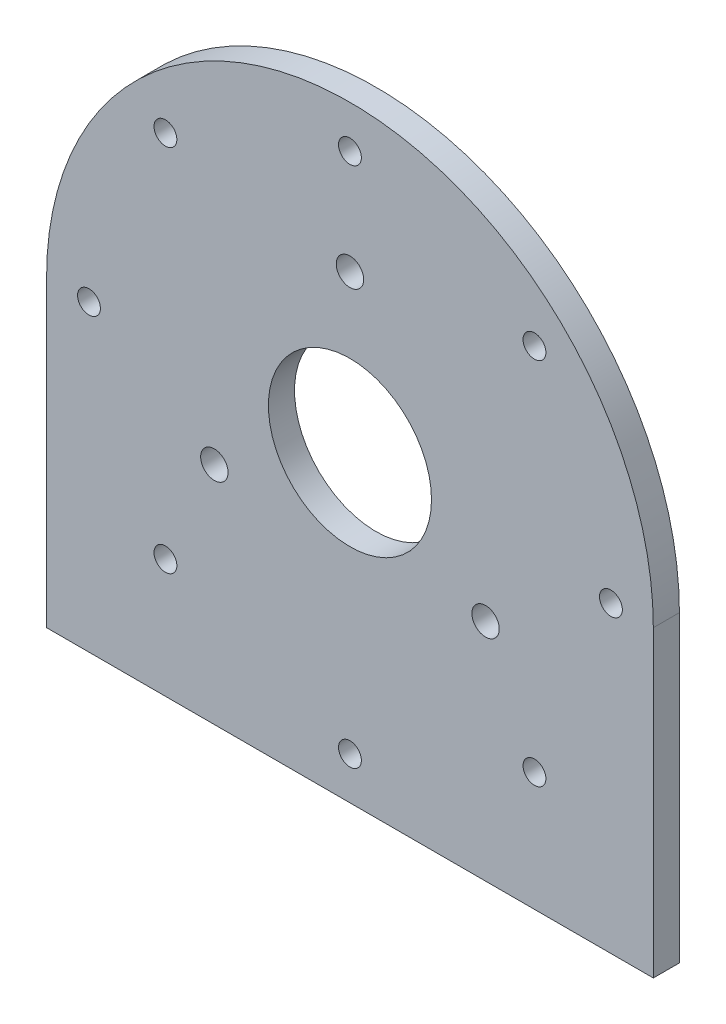
ISO-10303-21;
HEADER;
FILE_DESCRIPTION(('STEP AP214'),'2;1');
FILE_NAME('part.step','',(''),(''),'','','');
FILE_SCHEMA(('AUTOMOTIVE_DESIGN { 1 0 10303 214 1 1 1 1 }'));
ENDSEC;
DATA;
#1=APPLICATION_CONTEXT('core data for automotive mechanical design processes');
#2=APPLICATION_PROTOCOL_DEFINITION('international standard','automotive_design',2000,#1);
#3=PRODUCT_CONTEXT('',#1,'mechanical');
#4=PRODUCT('Part','Part','',(#3));
#5=PRODUCT_RELATED_PRODUCT_CATEGORY('part','',(#4));
#6=PRODUCT_DEFINITION_FORMATION('','',#4);
#7=PRODUCT_DEFINITION_CONTEXT('part definition',#1,'design');
#8=PRODUCT_DEFINITION('design','',#6,#7);
#9=PRODUCT_DEFINITION_SHAPE('','',#8);
#10=(LENGTH_UNIT() NAMED_UNIT(*) SI_UNIT(.MILLI.,.METRE.));
#11=(NAMED_UNIT(*) PLANE_ANGLE_UNIT() SI_UNIT($,.RADIAN.));
#12=(NAMED_UNIT(*) SI_UNIT($,.STERADIAN.) SOLID_ANGLE_UNIT());
#13=UNCERTAINTY_MEASURE_WITH_UNIT(LENGTH_MEASURE(1.E-05),#10,'distance_accuracy_value','');
#14=(GEOMETRIC_REPRESENTATION_CONTEXT(3) GLOBAL_UNCERTAINTY_ASSIGNED_CONTEXT((#13)) GLOBAL_UNIT_ASSIGNED_CONTEXT((#10,
#11,#12)) REPRESENTATION_CONTEXT('',''));
#15=CARTESIAN_POINT('',(0.,0.,0.));
#16=DIRECTION('',(0.,0.,1.));
#17=DIRECTION('',(1.,0.,0.));
#18=AXIS2_PLACEMENT_3D('',#15,#16,#17);
#19=CARTESIAN_POINT('',(0.,0.,4.));
#20=DIRECTION('',(0.,0.,-1.));
#21=DIRECTION('',(-1.,0.,0.));
#22=AXIS2_PLACEMENT_3D('',#19,#20,#21);
#23=CYLINDRICAL_SURFACE('',#22,46.5);
#24=CARTESIAN_POINT('',(0.,0.,0.));
#25=DIRECTION('',(0.,0.,1.));
#26=DIRECTION('',(1.,0.,0.));
#27=AXIS2_PLACEMENT_3D('',#24,#25,#26);
#28=CIRCLE('',#27,46.5);
#29=CARTESIAN_POINT('',(-46.5,0.,0.));
#30=VERTEX_POINT('',#29);
#31=CARTESIAN_POINT('',(46.5,0.,0.));
#32=VERTEX_POINT('',#31);
#33=EDGE_CURVE('E119',#30,#32,#28,.F.);
#34=ORIENTED_EDGE('',*,*,#33,.F.);
#35=DIRECTION('',(0.,0.,-1.));
#36=VECTOR('',#35,1.);
#37=CARTESIAN_POINT('',(-46.5,0.,4.));
#38=LINE('',#37,#36);
#39=CARTESIAN_POINT('',(-46.5,0.,4.));
#40=VERTEX_POINT('',#39);
#41=EDGE_CURVE('E11',#40,#30,#38,.T.);
#42=ORIENTED_EDGE('',*,*,#41,.F.);
#43=CARTESIAN_POINT('',(0.,0.,4.));
#44=DIRECTION('',(0.,0.,1.));
#45=DIRECTION('',(1.,0.,0.));
#46=AXIS2_PLACEMENT_3D('',#43,#44,#45);
#47=CIRCLE('',#46,46.5);
#48=CARTESIAN_POINT('',(46.5,0.,4.));
#49=VERTEX_POINT('',#48);
#50=EDGE_CURVE('E98',#40,#49,#47,.F.);
#51=ORIENTED_EDGE('',*,*,#50,.T.);
#52=DIRECTION('',(0.,0.,-1.));
#53=VECTOR('',#52,1.);
#54=CARTESIAN_POINT('',(46.5,0.,4.));
#55=LINE('',#54,#53);
#56=EDGE_CURVE('E79',#49,#32,#55,.T.);
#57=ORIENTED_EDGE('',*,*,#56,.T.);
#58=EDGE_LOOP('',(#34,#42,#51,#57));
#59=FACE_BOUND('',#58,.T.);
#60=ADVANCED_FACE('F40',(#59),#23,.T.);
#61=CARTESIAN_POINT('',(-46.5,0.,4.));
#62=DIRECTION('',(1.,0.,0.));
#63=DIRECTION('',(0.,0.,-1.));
#64=AXIS2_PLACEMENT_3D('',#61,#62,#63);
#65=PLANE('',#64);
#66=DIRECTION('',(0.,-1.,0.));
#67=VECTOR('',#66,1.);
#68=CARTESIAN_POINT('',(-46.5,0.,0.));
#69=LINE('',#68,#67);
#70=CARTESIAN_POINT('',(-46.5,-46.5,0.));
#71=VERTEX_POINT('',#70);
#72=EDGE_CURVE('E103',#30,#71,#69,.T.);
#73=ORIENTED_EDGE('',*,*,#72,.T.);
#74=DIRECTION('',(0.,0.,-1.));
#75=VECTOR('',#74,1.);
#76=CARTESIAN_POINT('',(-46.5,-46.5,4.));
#77=LINE('',#76,#75);
#78=CARTESIAN_POINT('',(-46.5,-46.5,4.));
#79=VERTEX_POINT('',#78);
#80=EDGE_CURVE('E49',#79,#71,#77,.T.);
#81=ORIENTED_EDGE('',*,*,#80,.F.);
#82=DIRECTION('',(0.,-1.,0.));
#83=VECTOR('',#82,1.);
#84=CARTESIAN_POINT('',(-46.5,0.,4.));
#85=LINE('',#84,#83);
#86=EDGE_CURVE('E94',#40,#79,#85,.T.);
#87=ORIENTED_EDGE('',*,*,#86,.F.);
#88=ORIENTED_EDGE('',*,*,#41,.T.);
#89=EDGE_LOOP('',(#73,#81,#87,#88));
#90=FACE_BOUND('',#89,.T.);
#91=ADVANCED_FACE('F101',(#90),#65,.F.);
#92=CARTESIAN_POINT('',(0.,-46.5,4.));
#93=DIRECTION('',(0.,1.,0.));
#94=DIRECTION('',(0.,0.,1.));
#95=AXIS2_PLACEMENT_3D('',#92,#93,#94);
#96=PLANE('',#95);
#97=DIRECTION('',(1.,0.,0.));
#98=VECTOR('',#97,1.);
#99=CARTESIAN_POINT('',(0.,-46.5,0.));
#100=LINE('',#99,#98);
#101=CARTESIAN_POINT('',(46.5,-46.5,0.));
#102=VERTEX_POINT('',#101);
#103=EDGE_CURVE('E116',#71,#102,#100,.T.);
#104=ORIENTED_EDGE('',*,*,#103,.T.);
#105=DIRECTION('',(0.,0.,-1.));
#106=VECTOR('',#105,1.);
#107=CARTESIAN_POINT('',(46.5,-46.5,4.));
#108=LINE('',#107,#106);
#109=CARTESIAN_POINT('',(46.5,-46.5,4.));
#110=VERTEX_POINT('',#109);
#111=EDGE_CURVE('E93',#110,#102,#108,.T.);
#112=ORIENTED_EDGE('',*,*,#111,.F.);
#113=DIRECTION('',(1.,0.,0.));
#114=VECTOR('',#113,1.);
#115=CARTESIAN_POINT('',(0.,-46.5,4.));
#116=LINE('',#115,#114);
#117=EDGE_CURVE('E87',#79,#110,#116,.T.);
#118=ORIENTED_EDGE('',*,*,#117,.F.);
#119=ORIENTED_EDGE('',*,*,#80,.T.);
#120=EDGE_LOOP('',(#104,#112,#118,#119));
#121=FACE_BOUND('',#120,.T.);
#122=ADVANCED_FACE('F90',(#121),#96,.F.);
#123=CARTESIAN_POINT('',(20.7846096908265,-12.0000000000001,4.));
#124=DIRECTION('',(0.,0.,-1.));
#125=DIRECTION('',(-1.,0.,0.));
#126=AXIS2_PLACEMENT_3D('',#123,#124,#125);
#127=CYLINDRICAL_SURFACE('',#126,2.1);
#128=CARTESIAN_POINT('',(20.7846096908265,-12.0000000000001,4.));
#129=DIRECTION('',(0.,0.,1.));
#130=DIRECTION('',(1.,0.,0.));
#131=AXIS2_PLACEMENT_3D('',#128,#129,#130);
#132=CIRCLE('',#131,2.1);
#133=CARTESIAN_POINT('',(22.8846096908265,-12.0000000000001,4.));
#134=VERTEX_POINT('',#133);
#135=EDGE_CURVE('E153',#134,#134,#132,.T.);
#136=ORIENTED_EDGE('',*,*,#135,.T.);
#137=EDGE_LOOP('',(#136));
#138=FACE_BOUND('',#137,.T.);
#139=CARTESIAN_POINT('',(20.7846096908265,-12.0000000000001,0.));
#140=DIRECTION('',(0.,0.,1.));
#141=DIRECTION('',(1.,0.,0.));
#142=AXIS2_PLACEMENT_3D('',#139,#140,#141);
#143=CIRCLE('',#142,2.1);
#144=CARTESIAN_POINT('',(22.8846096908265,-12.0000000000001,0.));
#145=VERTEX_POINT('',#144);
#146=EDGE_CURVE('E112',#145,#145,#143,.T.);
#147=ORIENTED_EDGE('',*,*,#146,.F.);
#148=EDGE_LOOP('',(#147));
#149=FACE_BOUND('',#148,.T.);
#150=ADVANCED_FACE('F390',(#138,#149),#127,.F.);
#151=CARTESIAN_POINT('',(46.5,0.,4.));
#152=DIRECTION('',(-1.,0.,0.));
#153=DIRECTION('',(0.,0.,1.));
#154=AXIS2_PLACEMENT_3D('',#151,#152,#153);
#155=PLANE('',#154);
#156=DIRECTION('',(0.,1.,0.));
#157=VECTOR('',#156,1.);
#158=CARTESIAN_POINT('',(46.5,0.,0.));
#159=LINE('',#158,#157);
#160=EDGE_CURVE('E72',#102,#32,#159,.T.);
#161=ORIENTED_EDGE('',*,*,#160,.T.);
#162=ORIENTED_EDGE('',*,*,#56,.F.);
#163=DIRECTION('',(0.,1.,0.));
#164=VECTOR('',#163,1.);
#165=CARTESIAN_POINT('',(46.5,0.,4.));
#166=LINE('',#165,#164);
#167=EDGE_CURVE('E57',#110,#49,#166,.T.);
#168=ORIENTED_EDGE('',*,*,#167,.F.);
#169=ORIENTED_EDGE('',*,*,#111,.T.);
#170=EDGE_LOOP('',(#161,#162,#168,#169));
#171=FACE_BOUND('',#170,.T.);
#172=ADVANCED_FACE('F217',(#171),#155,.F.);
#173=CARTESIAN_POINT('',(0.,0.,4.));
#174=DIRECTION('',(0.,0.,-1.));
#175=DIRECTION('',(-1.,0.,0.));
#176=AXIS2_PLACEMENT_3D('',#173,#174,#175);
#177=CYLINDRICAL_SURFACE('',#176,12.5);
#178=CARTESIAN_POINT('',(0.,0.,4.));
#179=DIRECTION('',(0.,0.,1.));
#180=DIRECTION('',(1.,0.,0.));
#181=AXIS2_PLACEMENT_3D('',#178,#179,#180);
#182=CIRCLE('',#181,12.5);
#183=CARTESIAN_POINT('',(12.5,0.,4.));
#184=VERTEX_POINT('',#183);
#185=EDGE_CURVE('E158',#184,#184,#182,.T.);
#186=ORIENTED_EDGE('',*,*,#185,.T.);
#187=EDGE_LOOP('',(#186));
#188=FACE_BOUND('',#187,.T.);
#189=CARTESIAN_POINT('',(0.,0.,0.));
#190=DIRECTION('',(0.,0.,1.));
#191=DIRECTION('',(1.,0.,0.));
#192=AXIS2_PLACEMENT_3D('',#189,#190,#191);
#193=CIRCLE('',#192,12.5);
#194=CARTESIAN_POINT('',(12.5,0.,0.));
#195=VERTEX_POINT('',#194);
#196=EDGE_CURVE('E121',#195,#195,#193,.T.);
#197=ORIENTED_EDGE('',*,*,#196,.F.);
#198=EDGE_LOOP('',(#197));
#199=FACE_BOUND('',#198,.T.);
#200=ADVANCED_FACE('F213',(#188,#199),#177,.F.);
#201=CARTESIAN_POINT('',(28.2842712474624,28.2842712474631,4.));
#202=DIRECTION('',(0.,0.,-1.));
#203=DIRECTION('',(-1.,0.,0.));
#204=AXIS2_PLACEMENT_3D('',#201,#202,#203);
#205=CYLINDRICAL_SURFACE('',#204,1.7500000000002);
#206=CARTESIAN_POINT('',(28.2842712474624,28.2842712474631,4.));
#207=DIRECTION('',(0.,0.,1.));
#208=DIRECTION('',(1.,0.,0.));
#209=AXIS2_PLACEMENT_3D('',#206,#207,#208);
#210=CIRCLE('',#209,1.7500000000002);
#211=CARTESIAN_POINT('',(30.0342712474626,28.2842712474631,4.));
#212=VERTEX_POINT('',#211);
#213=EDGE_CURVE('E161',#212,#212,#210,.T.);
#214=ORIENTED_EDGE('',*,*,#213,.T.);
#215=EDGE_LOOP('',(#214));
#216=FACE_BOUND('',#215,.T.);
#217=CARTESIAN_POINT('',(28.2842712474624,28.2842712474631,0.));
#218=DIRECTION('',(0.,0.,1.));
#219=DIRECTION('',(1.,0.,0.));
#220=AXIS2_PLACEMENT_3D('',#217,#218,#219);
#221=CIRCLE('',#220,1.7500000000002);
#222=CARTESIAN_POINT('',(30.0342712474626,28.2842712474631,0.));
#223=VERTEX_POINT('',#222);
#224=EDGE_CURVE('E124',#223,#223,#221,.T.);
#225=ORIENTED_EDGE('',*,*,#224,.F.);
#226=EDGE_LOOP('',(#225));
#227=FACE_BOUND('',#226,.T.);
#228=ADVANCED_FACE('F216',(#216,#227),#205,.F.);
#229=CARTESIAN_POINT('',(40.0000000000017,1.70040397862765E-12,4.));
#230=DIRECTION('',(0.,0.,-1.));
#231=DIRECTION('',(-1.,0.,0.));
#232=AXIS2_PLACEMENT_3D('',#229,#230,#231);
#233=CYLINDRICAL_SURFACE('',#232,1.75000000000126);
#234=CARTESIAN_POINT('',(40.0000000000017,1.70040397862765E-12,4.));
#235=DIRECTION('',(0.,0.,1.));
#236=DIRECTION('',(1.,0.,0.));
#237=AXIS2_PLACEMENT_3D('',#234,#235,#236);
#238=CIRCLE('',#237,1.75000000000126);
#239=CARTESIAN_POINT('',(41.750000000003,1.70040397862765E-12,4.));
#240=VERTEX_POINT('',#239);
#241=EDGE_CURVE('E164',#240,#240,#238,.T.);
#242=ORIENTED_EDGE('',*,*,#241,.T.);
#243=EDGE_LOOP('',(#242));
#244=FACE_BOUND('',#243,.T.);
#245=CARTESIAN_POINT('',(40.0000000000017,1.70040397862765E-12,0.));
#246=DIRECTION('',(0.,0.,1.));
#247=DIRECTION('',(1.,0.,0.));
#248=AXIS2_PLACEMENT_3D('',#245,#246,#247);
#249=CIRCLE('',#248,1.75000000000126);
#250=CARTESIAN_POINT('',(41.750000000003,1.70040397862765E-12,0.));
#251=VERTEX_POINT('',#250);
#252=EDGE_CURVE('E127',#251,#251,#249,.T.);
#253=ORIENTED_EDGE('',*,*,#252,.F.);
#254=EDGE_LOOP('',(#253));
#255=FACE_BOUND('',#254,.T.);
#256=ADVANCED_FACE('F247',(#244,#255),#233,.F.);
#257=CARTESIAN_POINT('',(28.2842712474648,-28.2842712474607,4.));
#258=DIRECTION('',(0.,0.,-1.));
#259=DIRECTION('',(-1.,0.,0.));
#260=AXIS2_PLACEMENT_3D('',#257,#258,#259);
#261=CYLINDRICAL_SURFACE('',#260,1.75000000000262);
#262=CARTESIAN_POINT('',(28.2842712474648,-28.2842712474607,4.));
#263=DIRECTION('',(0.,0.,1.));
#264=DIRECTION('',(1.,0.,0.));
#265=AXIS2_PLACEMENT_3D('',#262,#263,#264);
#266=CIRCLE('',#265,1.75000000000262);
#267=CARTESIAN_POINT('',(30.0342712474674,-28.2842712474607,4.));
#268=VERTEX_POINT('',#267);
#269=EDGE_CURVE('E167',#268,#268,#266,.T.);
#270=ORIENTED_EDGE('',*,*,#269,.T.);
#271=EDGE_LOOP('',(#270));
#272=FACE_BOUND('',#271,.T.);
#273=CARTESIAN_POINT('',(28.2842712474648,-28.2842712474607,0.));
#274=DIRECTION('',(0.,0.,1.));
#275=DIRECTION('',(1.,0.,0.));
#276=AXIS2_PLACEMENT_3D('',#273,#274,#275);
#277=CIRCLE('',#276,1.75000000000262);
#278=CARTESIAN_POINT('',(30.0342712474674,-28.2842712474607,0.));
#279=VERTEX_POINT('',#278);
#280=EDGE_CURVE('E130',#279,#279,#277,.T.);
#281=ORIENTED_EDGE('',*,*,#280,.F.);
#282=EDGE_LOOP('',(#281));
#283=FACE_BOUND('',#282,.T.);
#284=ADVANCED_FACE('F251',(#272,#283),#261,.F.);
#285=CARTESIAN_POINT('',(3.4008079572553E-12,-40.,4.));
#286=DIRECTION('',(0.,0.,-1.));
#287=DIRECTION('',(-1.,0.,0.));
#288=AXIS2_PLACEMENT_3D('',#285,#286,#287);
#289=CYLINDRICAL_SURFACE('',#288,1.75000000000352);
#290=CARTESIAN_POINT('',(3.4008079572553E-12,-40.,4.));
#291=DIRECTION('',(0.,0.,1.));
#292=DIRECTION('',(1.,0.,0.));
#293=AXIS2_PLACEMENT_3D('',#290,#291,#292);
#294=CIRCLE('',#293,1.75000000000352);
#295=CARTESIAN_POINT('',(1.75000000000692,-40.,4.));
#296=VERTEX_POINT('',#295);
#297=EDGE_CURVE('E170',#296,#296,#294,.T.);
#298=ORIENTED_EDGE('',*,*,#297,.T.);
#299=EDGE_LOOP('',(#298));
#300=FACE_BOUND('',#299,.T.);
#301=CARTESIAN_POINT('',(3.4008079572553E-12,-40.,0.));
#302=DIRECTION('',(0.,0.,1.));
#303=DIRECTION('',(1.,0.,0.));
#304=AXIS2_PLACEMENT_3D('',#301,#302,#303);
#305=CIRCLE('',#304,1.75000000000352);
#306=CARTESIAN_POINT('',(1.75000000000692,-40.,0.));
#307=VERTEX_POINT('',#306);
#308=EDGE_CURVE('E133',#307,#307,#305,.T.);
#309=ORIENTED_EDGE('',*,*,#308,.F.);
#310=EDGE_LOOP('',(#309));
#311=FACE_BOUND('',#310,.T.);
#312=ADVANCED_FACE('F255',(#300,#311),#289,.F.);
#313=CARTESIAN_POINT('',(-28.284271247459,-28.2842712474631,4.));
#314=DIRECTION('',(0.,0.,-1.));
#315=DIRECTION('',(-1.,0.,0.));
#316=AXIS2_PLACEMENT_3D('',#313,#314,#315);
#317=CYLINDRICAL_SURFACE('',#316,1.75000000000346);
#318=CARTESIAN_POINT('',(-28.284271247459,-28.2842712474631,4.));
#319=DIRECTION('',(0.,0.,1.));
#320=DIRECTION('',(1.,0.,0.));
#321=AXIS2_PLACEMENT_3D('',#318,#319,#320);
#322=CIRCLE('',#321,1.75000000000346);
#323=CARTESIAN_POINT('',(-26.5342712474555,-28.2842712474631,4.));
#324=VERTEX_POINT('',#323);
#325=EDGE_CURVE('E173',#324,#324,#322,.T.);
#326=ORIENTED_EDGE('',*,*,#325,.T.);
#327=EDGE_LOOP('',(#326));
#328=FACE_BOUND('',#327,.T.);
#329=CARTESIAN_POINT('',(-28.284271247459,-28.2842712474631,0.));
#330=DIRECTION('',(0.,0.,1.));
#331=DIRECTION('',(1.,0.,0.));
#332=AXIS2_PLACEMENT_3D('',#329,#330,#331);
#333=CIRCLE('',#332,1.75000000000346);
#334=CARTESIAN_POINT('',(-26.5342712474555,-28.2842712474631,0.));
#335=VERTEX_POINT('',#334);
#336=EDGE_CURVE('E136',#335,#335,#333,.T.);
#337=ORIENTED_EDGE('',*,*,#336,.F.);
#338=EDGE_LOOP('',(#337));
#339=FACE_BOUND('',#338,.T.);
#340=ADVANCED_FACE('F259',(#328,#339),#317,.F.);
#341=CARTESIAN_POINT('',(-39.9999999999983,-1.70530256582424E-12,4.));
#342=DIRECTION('',(0.,0.,-1.));
#343=DIRECTION('',(-1.,0.,0.));
#344=AXIS2_PLACEMENT_3D('',#341,#342,#343);
#345=CYLINDRICAL_SURFACE('',#344,1.75000000000253);
#346=CARTESIAN_POINT('',(-39.9999999999983,-1.70530256582424E-12,4.));
#347=DIRECTION('',(0.,0.,1.));
#348=DIRECTION('',(1.,0.,0.));
#349=AXIS2_PLACEMENT_3D('',#346,#347,#348);
#350=CIRCLE('',#349,1.75000000000253);
#351=CARTESIAN_POINT('',(-38.2499999999958,-1.70530256582424E-12,4.));
#352=VERTEX_POINT('',#351);
#353=EDGE_CURVE('E176',#352,#352,#350,.T.);
#354=ORIENTED_EDGE('',*,*,#353,.T.);
#355=EDGE_LOOP('',(#354));
#356=FACE_BOUND('',#355,.T.);
#357=CARTESIAN_POINT('',(-39.9999999999983,-1.70530256582424E-12,0.));
#358=DIRECTION('',(0.,0.,1.));
#359=DIRECTION('',(1.,0.,0.));
#360=AXIS2_PLACEMENT_3D('',#357,#358,#359);
#361=CIRCLE('',#360,1.75000000000253);
#362=CARTESIAN_POINT('',(-38.2499999999958,-1.70530256582424E-12,0.));
#363=VERTEX_POINT('',#362);
#364=EDGE_CURVE('E139',#363,#363,#361,.T.);
#365=ORIENTED_EDGE('',*,*,#364,.F.);
#366=EDGE_LOOP('',(#365));
#367=FACE_BOUND('',#366,.T.);
#368=ADVANCED_FACE('F263',(#356,#367),#345,.F.);
#369=CARTESIAN_POINT('',(-28.2842712474614,28.2842712474607,4.));
#370=DIRECTION('',(0.,0.,-1.));
#371=DIRECTION('',(-1.,0.,0.));
#372=AXIS2_PLACEMENT_3D('',#369,#370,#371);
#373=CYLINDRICAL_SURFACE('',#372,1.7500000000013);
#374=CARTESIAN_POINT('',(-28.2842712474614,28.2842712474607,4.));
#375=DIRECTION('',(0.,0.,1.));
#376=DIRECTION('',(1.,0.,0.));
#377=AXIS2_PLACEMENT_3D('',#374,#375,#376);
#378=CIRCLE('',#377,1.7500000000013);
#379=CARTESIAN_POINT('',(-26.5342712474601,28.2842712474607,4.));
#380=VERTEX_POINT('',#379);
#381=EDGE_CURVE('E179',#380,#380,#378,.T.);
#382=ORIENTED_EDGE('',*,*,#381,.T.);
#383=EDGE_LOOP('',(#382));
#384=FACE_BOUND('',#383,.T.);
#385=CARTESIAN_POINT('',(-28.2842712474614,28.2842712474607,0.));
#386=DIRECTION('',(0.,0.,1.));
#387=DIRECTION('',(1.,0.,0.));
#388=AXIS2_PLACEMENT_3D('',#385,#386,#387);
#389=CIRCLE('',#388,1.7500000000013);
#390=CARTESIAN_POINT('',(-26.5342712474601,28.2842712474607,0.));
#391=VERTEX_POINT('',#390);
#392=EDGE_CURVE('E142',#391,#391,#389,.T.);
#393=ORIENTED_EDGE('',*,*,#392,.F.);
#394=EDGE_LOOP('',(#393));
#395=FACE_BOUND('',#394,.T.);
#396=ADVANCED_FACE('F267',(#384,#395),#373,.F.);
#397=CARTESIAN_POINT('',(0.,24.,4.));
#398=DIRECTION('',(0.,0.,-1.));
#399=DIRECTION('',(-1.,0.,0.));
#400=AXIS2_PLACEMENT_3D('',#397,#398,#399);
#401=CYLINDRICAL_SURFACE('',#400,2.1);
#402=CARTESIAN_POINT('',(0.,24.,4.));
#403=DIRECTION('',(0.,0.,1.));
#404=DIRECTION('',(1.,0.,0.));
#405=AXIS2_PLACEMENT_3D('',#402,#403,#404);
#406=CIRCLE('',#405,2.1);
#407=CARTESIAN_POINT('',(2.1,24.,4.));
#408=VERTEX_POINT('',#407);
#409=EDGE_CURVE('E182',#408,#408,#406,.T.);
#410=ORIENTED_EDGE('',*,*,#409,.T.);
#411=EDGE_LOOP('',(#410));
#412=FACE_BOUND('',#411,.T.);
#413=CARTESIAN_POINT('',(0.,24.,0.));
#414=DIRECTION('',(0.,0.,1.));
#415=DIRECTION('',(1.,0.,0.));
#416=AXIS2_PLACEMENT_3D('',#413,#414,#415);
#417=CIRCLE('',#416,2.1);
#418=CARTESIAN_POINT('',(2.1,24.,0.));
#419=VERTEX_POINT('',#418);
#420=EDGE_CURVE('E145',#419,#419,#417,.T.);
#421=ORIENTED_EDGE('',*,*,#420,.F.);
#422=EDGE_LOOP('',(#421));
#423=FACE_BOUND('',#422,.T.);
#424=ADVANCED_FACE('F235',(#412,#423),#401,.F.);
#425=CARTESIAN_POINT('',(0.,40.,4.));
#426=DIRECTION('',(0.,0.,-1.));
#427=DIRECTION('',(-1.,0.,0.));
#428=AXIS2_PLACEMENT_3D('',#425,#426,#427);
#429=CYLINDRICAL_SURFACE('',#428,1.75);
#430=CARTESIAN_POINT('',(0.,40.,4.));
#431=DIRECTION('',(0.,0.,1.));
#432=DIRECTION('',(1.,0.,0.));
#433=AXIS2_PLACEMENT_3D('',#430,#431,#432);
#434=CIRCLE('',#433,1.75);
#435=CARTESIAN_POINT('',(1.75,40.,4.));
#436=VERTEX_POINT('',#435);
#437=EDGE_CURVE('E111',#436,#436,#434,.T.);
#438=ORIENTED_EDGE('',*,*,#437,.T.);
#439=EDGE_LOOP('',(#438));
#440=FACE_BOUND('',#439,.T.);
#441=CARTESIAN_POINT('',(0.,40.,0.));
#442=DIRECTION('',(0.,0.,1.));
#443=DIRECTION('',(1.,0.,0.));
#444=AXIS2_PLACEMENT_3D('',#441,#442,#443);
#445=CIRCLE('',#444,1.75);
#446=CARTESIAN_POINT('',(1.75,40.,0.));
#447=VERTEX_POINT('',#446);
#448=EDGE_CURVE('E148',#447,#447,#445,.T.);
#449=ORIENTED_EDGE('',*,*,#448,.F.);
#450=EDGE_LOOP('',(#449));
#451=FACE_BOUND('',#450,.T.);
#452=ADVANCED_FACE('F42',(#440,#451),#429,.F.);
#453=CARTESIAN_POINT('',(-20.7846096908265,-12.0000000000001,4.));
#454=DIRECTION('',(0.,0.,-1.));
#455=DIRECTION('',(-1.,0.,0.));
#456=AXIS2_PLACEMENT_3D('',#453,#454,#455);
#457=CYLINDRICAL_SURFACE('',#456,2.1);
#458=CARTESIAN_POINT('',(-20.7846096908265,-12.0000000000001,4.));
#459=DIRECTION('',(0.,0.,1.));
#460=DIRECTION('',(1.,0.,0.));
#461=AXIS2_PLACEMENT_3D('',#458,#459,#460);
#462=CIRCLE('',#461,2.1);
#463=CARTESIAN_POINT('',(-18.6846096908265,-12.0000000000001,4.));
#464=VERTEX_POINT('',#463);
#465=EDGE_CURVE('E107',#464,#464,#462,.T.);
#466=ORIENTED_EDGE('',*,*,#465,.T.);
#467=EDGE_LOOP('',(#466));
#468=FACE_BOUND('',#467,.T.);
#469=CARTESIAN_POINT('',(-20.7846096908265,-12.0000000000001,0.));
#470=DIRECTION('',(0.,0.,1.));
#471=DIRECTION('',(1.,0.,0.));
#472=AXIS2_PLACEMENT_3D('',#469,#470,#471);
#473=CIRCLE('',#472,2.1);
#474=CARTESIAN_POINT('',(-18.6846096908265,-12.0000000000001,0.));
#475=VERTEX_POINT('',#474);
#476=EDGE_CURVE('E108',#475,#475,#473,.T.);
#477=ORIENTED_EDGE('',*,*,#476,.F.);
#478=EDGE_LOOP('',(#477));
#479=FACE_BOUND('',#478,.T.);
#480=ADVANCED_FACE('F193',(#468,#479),#457,.F.);
#481=CARTESIAN_POINT('',(0.,0.,4.));
#482=DIRECTION('',(0.,0.,1.));
#483=DIRECTION('',(1.,0.,0.));
#484=AXIS2_PLACEMENT_3D('',#481,#482,#483);
#485=PLANE('',#484);
#486=ORIENTED_EDGE('',*,*,#437,.F.);
#487=EDGE_LOOP('',(#486));
#488=FACE_BOUND('',#487,.T.);
#489=ORIENTED_EDGE('',*,*,#409,.F.);
#490=EDGE_LOOP('',(#489));
#491=FACE_BOUND('',#490,.T.);
#492=ORIENTED_EDGE('',*,*,#381,.F.);
#493=EDGE_LOOP('',(#492));
#494=FACE_BOUND('',#493,.T.);
#495=ORIENTED_EDGE('',*,*,#353,.F.);
#496=EDGE_LOOP('',(#495));
#497=FACE_BOUND('',#496,.T.);
#498=ORIENTED_EDGE('',*,*,#325,.F.);
#499=EDGE_LOOP('',(#498));
#500=FACE_BOUND('',#499,.T.);
#501=ORIENTED_EDGE('',*,*,#297,.F.);
#502=EDGE_LOOP('',(#501));
#503=FACE_BOUND('',#502,.T.);
#504=ORIENTED_EDGE('',*,*,#269,.F.);
#505=EDGE_LOOP('',(#504));
#506=FACE_BOUND('',#505,.T.);
#507=ORIENTED_EDGE('',*,*,#241,.F.);
#508=EDGE_LOOP('',(#507));
#509=FACE_BOUND('',#508,.T.);
#510=ORIENTED_EDGE('',*,*,#213,.F.);
#511=EDGE_LOOP('',(#510));
#512=FACE_BOUND('',#511,.T.);
#513=ORIENTED_EDGE('',*,*,#185,.F.);
#514=EDGE_LOOP('',(#513));
#515=FACE_BOUND('',#514,.T.);
#516=ORIENTED_EDGE('',*,*,#50,.F.);
#517=ORIENTED_EDGE('',*,*,#86,.T.);
#518=ORIENTED_EDGE('',*,*,#117,.T.);
#519=ORIENTED_EDGE('',*,*,#167,.T.);
#520=EDGE_LOOP('',(#516,#517,#518,#519));
#521=FACE_BOUND('',#520,.T.);
#522=ORIENTED_EDGE('',*,*,#135,.F.);
#523=EDGE_LOOP('',(#522));
#524=FACE_BOUND('',#523,.T.);
#525=ORIENTED_EDGE('',*,*,#465,.F.);
#526=EDGE_LOOP('',(#525));
#527=FACE_BOUND('',#526,.T.);
#528=ADVANCED_FACE('F96',(#488,#491,#494,#497,#500,#503,#506,#509,#512,#515,#521,#524,#527),
#485,.T.);
#529=CARTESIAN_POINT('',(0.,0.,0.));
#530=DIRECTION('',(0.,0.,1.));
#531=DIRECTION('',(1.,0.,0.));
#532=AXIS2_PLACEMENT_3D('',#529,#530,#531);
#533=PLANE('',#532);
#534=ORIENTED_EDGE('',*,*,#448,.T.);
#535=EDGE_LOOP('',(#534));
#536=FACE_BOUND('',#535,.T.);
#537=ORIENTED_EDGE('',*,*,#420,.T.);
#538=EDGE_LOOP('',(#537));
#539=FACE_BOUND('',#538,.T.);
#540=ORIENTED_EDGE('',*,*,#392,.T.);
#541=EDGE_LOOP('',(#540));
#542=FACE_BOUND('',#541,.T.);
#543=ORIENTED_EDGE('',*,*,#364,.T.);
#544=EDGE_LOOP('',(#543));
#545=FACE_BOUND('',#544,.T.);
#546=ORIENTED_EDGE('',*,*,#336,.T.);
#547=EDGE_LOOP('',(#546));
#548=FACE_BOUND('',#547,.T.);
#549=ORIENTED_EDGE('',*,*,#308,.T.);
#550=EDGE_LOOP('',(#549));
#551=FACE_BOUND('',#550,.T.);
#552=ORIENTED_EDGE('',*,*,#280,.T.);
#553=EDGE_LOOP('',(#552));
#554=FACE_BOUND('',#553,.T.);
#555=ORIENTED_EDGE('',*,*,#252,.T.);
#556=EDGE_LOOP('',(#555));
#557=FACE_BOUND('',#556,.T.);
#558=ORIENTED_EDGE('',*,*,#224,.T.);
#559=EDGE_LOOP('',(#558));
#560=FACE_BOUND('',#559,.T.);
#561=ORIENTED_EDGE('',*,*,#196,.T.);
#562=EDGE_LOOP('',(#561));
#563=FACE_BOUND('',#562,.T.);
#564=ORIENTED_EDGE('',*,*,#33,.T.);
#565=ORIENTED_EDGE('',*,*,#160,.F.);
#566=ORIENTED_EDGE('',*,*,#103,.F.);
#567=ORIENTED_EDGE('',*,*,#72,.F.);
#568=EDGE_LOOP('',(#564,#565,#566,#567));
#569=FACE_BOUND('',#568,.T.);
#570=ORIENTED_EDGE('',*,*,#146,.T.);
#571=EDGE_LOOP('',(#570));
#572=FACE_BOUND('',#571,.T.);
#573=ORIENTED_EDGE('',*,*,#476,.T.);
#574=EDGE_LOOP('',(#573));
#575=FACE_BOUND('',#574,.T.);
#576=ADVANCED_FACE('F192',(#536,#539,#542,#545,#548,#551,#554,#557,#560,#563,#569,#572,#575),
#533,.F.);
#577=CLOSED_SHELL('',(#60,#91,#122,#150,#172,#200,#228,#256,#284,#312,#340,#368,#396,#424,#452,
#480,#528,#576));
#578=MANIFOLD_SOLID_BREP('B2',#577);
#579=ADVANCED_BREP_SHAPE_REPRESENTATION('',(#18,#578),#14);
#580=SHAPE_DEFINITION_REPRESENTATION(#9,#579);
ENDSEC;
END-ISO-10303-21;
